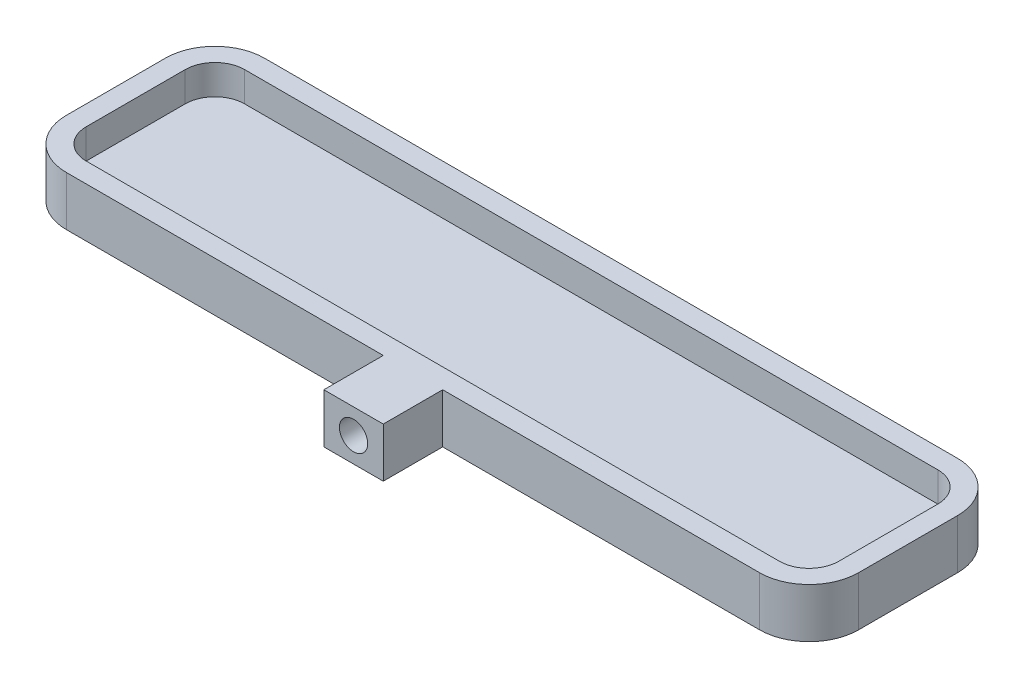
ISO-10303-21;
HEADER;
FILE_DESCRIPTION(('STEP AP214'),'2;1');
FILE_NAME('part.step','',(''),(''),'','','');
FILE_SCHEMA(('AUTOMOTIVE_DESIGN { 1 0 10303 214 1 1 1 1 }'));
ENDSEC;
DATA;
#1=APPLICATION_CONTEXT('core data for automotive mechanical design processes');
#2=APPLICATION_PROTOCOL_DEFINITION('international standard','automotive_design',2000,#1);
#3=PRODUCT_CONTEXT('',#1,'mechanical');
#4=PRODUCT('Part','Part','',(#3));
#5=PRODUCT_RELATED_PRODUCT_CATEGORY('part','',(#4));
#6=PRODUCT_DEFINITION_FORMATION('','',#4);
#7=PRODUCT_DEFINITION_CONTEXT('part definition',#1,'design');
#8=PRODUCT_DEFINITION('design','',#6,#7);
#9=PRODUCT_DEFINITION_SHAPE('','',#8);
#10=(LENGTH_UNIT() NAMED_UNIT(*) SI_UNIT(.MILLI.,.METRE.));
#11=(NAMED_UNIT(*) PLANE_ANGLE_UNIT() SI_UNIT($,.RADIAN.));
#12=(NAMED_UNIT(*) SI_UNIT($,.STERADIAN.) SOLID_ANGLE_UNIT());
#13=UNCERTAINTY_MEASURE_WITH_UNIT(LENGTH_MEASURE(1.E-05),#10,'distance_accuracy_value','');
#14=(GEOMETRIC_REPRESENTATION_CONTEXT(3) GLOBAL_UNCERTAINTY_ASSIGNED_CONTEXT((#13)) GLOBAL_UNIT_ASSIGNED_CONTEXT((#10,
#11,#12)) REPRESENTATION_CONTEXT('',''));
#15=CARTESIAN_POINT('',(0.,0.,0.));
#16=DIRECTION('',(0.,0.,1.));
#17=DIRECTION('',(1.,0.,0.));
#18=AXIS2_PLACEMENT_3D('',#15,#16,#17);
#19=CARTESIAN_POINT('',(-40.,5.,10.));
#20=DIRECTION('',(0.,0.,-1.));
#21=DIRECTION('',(-1.,0.,0.));
#22=AXIS2_PLACEMENT_3D('',#19,#20,#21);
#23=PLANE('',#22);
#24=DIRECTION('',(0.,1.,0.));
#25=VECTOR('',#24,1.);
#26=CARTESIAN_POINT('',(3.,0.,10.));
#27=LINE('',#26,#25);
#28=CARTESIAN_POINT('',(3.,0.,10.));
#29=VERTEX_POINT('',#28);
#30=CARTESIAN_POINT('',(3.,5.,10.));
#31=VERTEX_POINT('',#30);
#32=EDGE_CURVE('E202',#29,#31,#27,.T.);
#33=ORIENTED_EDGE('',*,*,#32,.F.);
#34=DIRECTION('',(1.,0.,0.));
#35=VECTOR('',#34,1.);
#36=CARTESIAN_POINT('',(-40.,0.,10.));
#37=LINE('',#36,#35);
#38=CARTESIAN_POINT('',(35.,0.,10.));
#39=VERTEX_POINT('',#38);
#40=EDGE_CURVE('E322',#29,#39,#37,.T.);
#41=ORIENTED_EDGE('',*,*,#40,.T.);
#42=DIRECTION('',(0.,-1.,0.));
#43=VECTOR('',#42,1.);
#44=CARTESIAN_POINT('',(35.,5.,10.));
#45=LINE('',#44,#43);
#46=CARTESIAN_POINT('',(35.,5.,10.));
#47=VERTEX_POINT('',#46);
#48=EDGE_CURVE('E367',#39,#47,#45,.F.);
#49=ORIENTED_EDGE('',*,*,#48,.T.);
#50=DIRECTION('',(1.,0.,0.));
#51=VECTOR('',#50,1.);
#52=CARTESIAN_POINT('',(-40.,5.,10.));
#53=LINE('',#52,#51);
#54=EDGE_CURVE('E55',#31,#47,#53,.T.);
#55=ORIENTED_EDGE('',*,*,#54,.F.);
#56=EDGE_LOOP('',(#33,#41,#49,#55));
#57=FACE_BOUND('',#56,.T.);
#58=ADVANCED_FACE('F39',(#57),#23,.F.);
#59=DIRECTION('',(0.,-1.,0.));
#60=VECTOR('',#59,1.);
#61=CARTESIAN_POINT('',(-3.,0.,10.));
#62=LINE('',#61,#60);
#63=CARTESIAN_POINT('',(-3.,5.,10.));
#64=VERTEX_POINT('',#63);
#65=CARTESIAN_POINT('',(-3.,0.,10.));
#66=VERTEX_POINT('',#65);
#67=EDGE_CURVE('E63',#64,#66,#62,.T.);
#68=ORIENTED_EDGE('',*,*,#67,.F.);
#69=CARTESIAN_POINT('',(-35.,5.,10.));
#70=VERTEX_POINT('',#69);
#71=EDGE_CURVE('E307',#70,#64,#53,.T.);
#72=ORIENTED_EDGE('',*,*,#71,.F.);
#73=DIRECTION('',(0.,-1.,0.));
#74=VECTOR('',#73,1.);
#75=CARTESIAN_POINT('',(-35.,5.,10.));
#76=LINE('',#75,#74);
#77=CARTESIAN_POINT('',(-35.,0.,10.));
#78=VERTEX_POINT('',#77);
#79=EDGE_CURVE('E363',#70,#78,#76,.T.);
#80=ORIENTED_EDGE('',*,*,#79,.T.);
#81=EDGE_CURVE('E299',#78,#66,#37,.T.);
#82=ORIENTED_EDGE('',*,*,#81,.T.);
#83=EDGE_LOOP('',(#68,#72,#80,#82));
#84=FACE_BOUND('',#83,.T.);
#85=ADVANCED_FACE('F388',(#84),#23,.F.);
#86=CARTESIAN_POINT('',(40.,5.,10.));
#87=DIRECTION('',(-1.,0.,0.));
#88=DIRECTION('',(0.,0.,1.));
#89=AXIS2_PLACEMENT_3D('',#86,#87,#88);
#90=PLANE('',#89);
#91=DIRECTION('',(0.,0.,-1.));
#92=VECTOR('',#91,1.);
#93=CARTESIAN_POINT('',(40.,0.,10.));
#94=LINE('',#93,#92);
#95=CARTESIAN_POINT('',(40.,0.,5.));
#96=VERTEX_POINT('',#95);
#97=CARTESIAN_POINT('',(40.,0.,-5.));
#98=VERTEX_POINT('',#97);
#99=EDGE_CURVE('E263',#96,#98,#94,.T.);
#100=ORIENTED_EDGE('',*,*,#99,.T.);
#101=DIRECTION('',(0.,-1.,0.));
#102=VECTOR('',#101,1.);
#103=CARTESIAN_POINT('',(40.,5.,-5.));
#104=LINE('',#103,#102);
#105=CARTESIAN_POINT('',(40.,5.,-5.));
#106=VERTEX_POINT('',#105);
#107=EDGE_CURVE('E348',#98,#106,#104,.F.);
#108=ORIENTED_EDGE('',*,*,#107,.T.);
#109=DIRECTION('',(0.,0.,-1.));
#110=VECTOR('',#109,1.);
#111=CARTESIAN_POINT('',(40.,5.,10.));
#112=LINE('',#111,#110);
#113=CARTESIAN_POINT('',(40.,5.,5.));
#114=VERTEX_POINT('',#113);
#115=EDGE_CURVE('E295',#114,#106,#112,.T.);
#116=ORIENTED_EDGE('',*,*,#115,.F.);
#117=DIRECTION('',(0.,-1.,0.));
#118=VECTOR('',#117,1.);
#119=CARTESIAN_POINT('',(40.,5.,5.));
#120=LINE('',#119,#118);
#121=EDGE_CURVE('E344',#114,#96,#120,.T.);
#122=ORIENTED_EDGE('',*,*,#121,.T.);
#123=EDGE_LOOP('',(#100,#108,#116,#122));
#124=FACE_BOUND('',#123,.T.);
#125=ADVANCED_FACE('F413',(#124),#90,.F.);
#126=CARTESIAN_POINT('',(-40.,5.,-10.));
#127=DIRECTION('',(0.,0.,1.));
#128=DIRECTION('',(1.,0.,0.));
#129=AXIS2_PLACEMENT_3D('',#126,#127,#128);
#130=PLANE('',#129);
#131=DIRECTION('',(-1.,0.,0.));
#132=VECTOR('',#131,1.);
#133=CARTESIAN_POINT('',(-40.,5.,-10.));
#134=LINE('',#133,#132);
#135=CARTESIAN_POINT('',(35.,5.,-10.));
#136=VERTEX_POINT('',#135);
#137=CARTESIAN_POINT('',(-35.,5.,-10.));
#138=VERTEX_POINT('',#137);
#139=EDGE_CURVE('E298',#136,#138,#134,.T.);
#140=ORIENTED_EDGE('',*,*,#139,.F.);
#141=DIRECTION('',(0.,-1.,0.));
#142=VECTOR('',#141,1.);
#143=CARTESIAN_POINT('',(35.,5.,-10.));
#144=LINE('',#143,#142);
#145=CARTESIAN_POINT('',(35.,0.,-10.));
#146=VERTEX_POINT('',#145);
#147=EDGE_CURVE('E327',#136,#146,#144,.T.);
#148=ORIENTED_EDGE('',*,*,#147,.T.);
#149=DIRECTION('',(-1.,0.,0.));
#150=VECTOR('',#149,1.);
#151=CARTESIAN_POINT('',(-40.,0.,-10.));
#152=LINE('',#151,#150);
#153=CARTESIAN_POINT('',(-35.,0.,-10.));
#154=VERTEX_POINT('',#153);
#155=EDGE_CURVE('E314',#146,#154,#152,.T.);
#156=ORIENTED_EDGE('',*,*,#155,.T.);
#157=DIRECTION('',(0.,-1.,0.));
#158=VECTOR('',#157,1.);
#159=CARTESIAN_POINT('',(-35.,5.,-10.));
#160=LINE('',#159,#158);
#161=EDGE_CURVE('E310',#154,#138,#160,.F.);
#162=ORIENTED_EDGE('',*,*,#161,.T.);
#163=EDGE_LOOP('',(#140,#148,#156,#162));
#164=FACE_BOUND('',#163,.T.);
#165=ADVANCED_FACE('F419',(#164),#130,.F.);
#166=CARTESIAN_POINT('',(-40.,5.,10.));
#167=DIRECTION('',(1.,0.,0.));
#168=DIRECTION('',(0.,0.,-1.));
#169=AXIS2_PLACEMENT_3D('',#166,#167,#168);
#170=PLANE('',#169);
#171=DIRECTION('',(0.,0.,1.));
#172=VECTOR('',#171,1.);
#173=CARTESIAN_POINT('',(-40.,0.,10.));
#174=LINE('',#173,#172);
#175=CARTESIAN_POINT('',(-40.,0.,-5.));
#176=VERTEX_POINT('',#175);
#177=CARTESIAN_POINT('',(-40.,0.,5.));
#178=VERTEX_POINT('',#177);
#179=EDGE_CURVE('E318',#176,#178,#174,.T.);
#180=ORIENTED_EDGE('',*,*,#179,.T.);
#181=DIRECTION('',(0.,-1.,0.));
#182=VECTOR('',#181,1.);
#183=CARTESIAN_POINT('',(-40.,5.,5.));
#184=LINE('',#183,#182);
#185=CARTESIAN_POINT('',(-40.,5.,5.));
#186=VERTEX_POINT('',#185);
#187=EDGE_CURVE('E11',#178,#186,#184,.F.);
#188=ORIENTED_EDGE('',*,*,#187,.T.);
#189=DIRECTION('',(0.,0.,1.));
#190=VECTOR('',#189,1.);
#191=CARTESIAN_POINT('',(-40.,5.,10.));
#192=LINE('',#191,#190);
#193=CARTESIAN_POINT('',(-40.,5.,-5.));
#194=VERTEX_POINT('',#193);
#195=EDGE_CURVE('E303',#194,#186,#192,.T.);
#196=ORIENTED_EDGE('',*,*,#195,.F.);
#197=DIRECTION('',(0.,-1.,0.));
#198=VECTOR('',#197,1.);
#199=CARTESIAN_POINT('',(-40.,5.,-5.));
#200=LINE('',#199,#198);
#201=EDGE_CURVE('E48',#194,#176,#200,.T.);
#202=ORIENTED_EDGE('',*,*,#201,.T.);
#203=EDGE_LOOP('',(#180,#188,#196,#202));
#204=FACE_BOUND('',#203,.T.);
#205=ADVANCED_FACE('F375',(#204),#170,.F.);
#206=CARTESIAN_POINT('',(0.,5.,0.));
#207=DIRECTION('',(0.,-1.,0.));
#208=DIRECTION('',(0.,0.,-1.));
#209=AXIS2_PLACEMENT_3D('',#206,#207,#208);
#210=PLANE('',#209);
#211=DIRECTION('',(0.,0.,-1.));
#212=VECTOR('',#211,1.);
#213=CARTESIAN_POINT('',(38.,5.,0.));
#214=LINE('',#213,#212);
#215=CARTESIAN_POINT('',(38.,5.,5.));
#216=VERTEX_POINT('',#215);
#217=CARTESIAN_POINT('',(38.,5.,-5.));
#218=VERTEX_POINT('',#217);
#219=EDGE_CURVE('E238',#216,#218,#214,.T.);
#220=ORIENTED_EDGE('',*,*,#219,.F.);
#221=CARTESIAN_POINT('',(35.,5.,5.));
#222=DIRECTION('',(0.,-1.,0.));
#223=DIRECTION('',(0.,0.,-1.));
#224=AXIS2_PLACEMENT_3D('',#221,#222,#223);
#225=CIRCLE('',#224,3.);
#226=CARTESIAN_POINT('',(35.,5.,8.));
#227=VERTEX_POINT('',#226);
#228=EDGE_CURVE('E278',#227,#216,#225,.F.);
#229=ORIENTED_EDGE('',*,*,#228,.F.);
#230=DIRECTION('',(1.,0.,0.));
#231=VECTOR('',#230,1.);
#232=CARTESIAN_POINT('',(0.,5.,8.));
#233=LINE('',#232,#231);
#234=CARTESIAN_POINT('',(-35.,5.,8.));
#235=VERTEX_POINT('',#234);
#236=EDGE_CURVE('E254',#235,#227,#233,.T.);
#237=ORIENTED_EDGE('',*,*,#236,.F.);
#238=CARTESIAN_POINT('',(-35.,5.,5.));
#239=DIRECTION('',(0.,-1.,0.));
#240=DIRECTION('',(0.,0.,-1.));
#241=AXIS2_PLACEMENT_3D('',#238,#239,#240);
#242=CIRCLE('',#241,3.);
#243=CARTESIAN_POINT('',(-38.,5.,5.));
#244=VERTEX_POINT('',#243);
#245=EDGE_CURVE('E285',#244,#235,#242,.F.);
#246=ORIENTED_EDGE('',*,*,#245,.F.);
#247=DIRECTION('',(0.,0.,1.));
#248=VECTOR('',#247,1.);
#249=CARTESIAN_POINT('',(-38.,5.,0.));
#250=LINE('',#249,#248);
#251=CARTESIAN_POINT('',(-38.,5.,-5.));
#252=VERTEX_POINT('',#251);
#253=EDGE_CURVE('E282',#252,#244,#250,.T.);
#254=ORIENTED_EDGE('',*,*,#253,.F.);
#255=CARTESIAN_POINT('',(-35.,5.,-5.));
#256=DIRECTION('',(0.,-1.,0.));
#257=DIRECTION('',(0.,0.,-1.));
#258=AXIS2_PLACEMENT_3D('',#255,#256,#257);
#259=CIRCLE('',#258,3.);
#260=CARTESIAN_POINT('',(-35.,5.,-8.));
#261=VERTEX_POINT('',#260);
#262=EDGE_CURVE('E218',#261,#252,#259,.F.);
#263=ORIENTED_EDGE('',*,*,#262,.F.);
#264=DIRECTION('',(-1.,0.,0.));
#265=VECTOR('',#264,1.);
#266=CARTESIAN_POINT('',(0.,5.,-8.));
#267=LINE('',#266,#265);
#268=CARTESIAN_POINT('',(35.,5.,-8.));
#269=VERTEX_POINT('',#268);
#270=EDGE_CURVE('E275',#269,#261,#267,.T.);
#271=ORIENTED_EDGE('',*,*,#270,.F.);
#272=CARTESIAN_POINT('',(35.,5.,-5.));
#273=DIRECTION('',(0.,-1.,0.));
#274=DIRECTION('',(0.,0.,-1.));
#275=AXIS2_PLACEMENT_3D('',#272,#273,#274);
#276=CIRCLE('',#275,3.);
#277=EDGE_CURVE('E268',#218,#269,#276,.F.);
#278=ORIENTED_EDGE('',*,*,#277,.F.);
#279=EDGE_LOOP('',(#220,#229,#237,#246,#254,#263,#271,#278));
#280=FACE_BOUND('',#279,.T.);
#281=ORIENTED_EDGE('',*,*,#115,.T.);
#282=CARTESIAN_POINT('',(35.,5.,-5.));
#283=DIRECTION('',(0.,-1.,0.));
#284=DIRECTION('',(0.,0.,-1.));
#285=AXIS2_PLACEMENT_3D('',#282,#283,#284);
#286=CIRCLE('',#285,5.);
#287=EDGE_CURVE('E360',#106,#136,#286,.F.);
#288=ORIENTED_EDGE('',*,*,#287,.T.);
#289=ORIENTED_EDGE('',*,*,#139,.T.);
#290=CARTESIAN_POINT('',(-35.,5.,-5.));
#291=DIRECTION('',(0.,-1.,0.));
#292=DIRECTION('',(0.,0.,-1.));
#293=AXIS2_PLACEMENT_3D('',#290,#291,#292);
#294=CIRCLE('',#293,5.);
#295=EDGE_CURVE('E351',#138,#194,#294,.F.);
#296=ORIENTED_EDGE('',*,*,#295,.T.);
#297=ORIENTED_EDGE('',*,*,#195,.T.);
#298=CARTESIAN_POINT('',(-35.,5.,5.));
#299=DIRECTION('',(0.,-1.,0.));
#300=DIRECTION('',(0.,0.,-1.));
#301=AXIS2_PLACEMENT_3D('',#298,#299,#300);
#302=CIRCLE('',#301,5.);
#303=EDGE_CURVE('E354',#186,#70,#302,.F.);
#304=ORIENTED_EDGE('',*,*,#303,.T.);
#305=ORIENTED_EDGE('',*,*,#71,.T.);
#306=DIRECTION('',(0.,0.,-1.));
#307=VECTOR('',#306,1.);
#308=CARTESIAN_POINT('',(-3.,5.,16.));
#309=LINE('',#308,#307);
#310=CARTESIAN_POINT('',(-3.,5.,16.));
#311=VERTEX_POINT('',#310);
#312=EDGE_CURVE('E185',#311,#64,#309,.T.);
#313=ORIENTED_EDGE('',*,*,#312,.F.);
#314=DIRECTION('',(-1.,0.,0.));
#315=VECTOR('',#314,1.);
#316=CARTESIAN_POINT('',(-3.,5.,16.));
#317=LINE('',#316,#315);
#318=CARTESIAN_POINT('',(3.,5.,16.));
#319=VERTEX_POINT('',#318);
#320=EDGE_CURVE('E177',#319,#311,#317,.T.);
#321=ORIENTED_EDGE('',*,*,#320,.F.);
#322=DIRECTION('',(0.,0.,-1.));
#323=VECTOR('',#322,1.);
#324=CARTESIAN_POINT('',(3.,5.,16.));
#325=LINE('',#324,#323);
#326=EDGE_CURVE('E182',#319,#31,#325,.T.);
#327=ORIENTED_EDGE('',*,*,#326,.T.);
#328=ORIENTED_EDGE('',*,*,#54,.T.);
#329=CARTESIAN_POINT('',(35.,5.,5.));
#330=DIRECTION('',(0.,-1.,0.));
#331=DIRECTION('',(0.,0.,-1.));
#332=AXIS2_PLACEMENT_3D('',#329,#330,#331);
#333=CIRCLE('',#332,5.);
#334=EDGE_CURVE('E357',#47,#114,#333,.F.);
#335=ORIENTED_EDGE('',*,*,#334,.T.);
#336=EDGE_LOOP('',(#281,#288,#289,#296,#297,#304,#305,#313,#321,#327,#328,#335));
#337=FACE_BOUND('',#336,.T.);
#338=ADVANCED_FACE('F180',(#280,#337),#210,.F.);
#339=CARTESIAN_POINT('',(0.,0.,0.));
#340=DIRECTION('',(0.,-1.,0.));
#341=DIRECTION('',(0.,0.,-1.));
#342=AXIS2_PLACEMENT_3D('',#339,#340,#341);
#343=PLANE('',#342);
#344=ORIENTED_EDGE('',*,*,#155,.F.);
#345=CARTESIAN_POINT('',(35.,0.,-5.));
#346=DIRECTION('',(0.,-1.,0.));
#347=DIRECTION('',(0.,0.,-1.));
#348=AXIS2_PLACEMENT_3D('',#345,#346,#347);
#349=CIRCLE('',#348,5.);
#350=EDGE_CURVE('E341',#146,#98,#349,.T.);
#351=ORIENTED_EDGE('',*,*,#350,.T.);
#352=ORIENTED_EDGE('',*,*,#99,.F.);
#353=CARTESIAN_POINT('',(35.,0.,5.));
#354=DIRECTION('',(0.,-1.,0.));
#355=DIRECTION('',(0.,0.,-1.));
#356=AXIS2_PLACEMENT_3D('',#353,#354,#355);
#357=CIRCLE('',#356,5.);
#358=EDGE_CURVE('E337',#96,#39,#357,.T.);
#359=ORIENTED_EDGE('',*,*,#358,.T.);
#360=ORIENTED_EDGE('',*,*,#40,.F.);
#361=DIRECTION('',(0.,0.,-1.));
#362=VECTOR('',#361,1.);
#363=CARTESIAN_POINT('',(3.,0.,16.));
#364=LINE('',#363,#362);
#365=CARTESIAN_POINT('',(3.,0.,16.));
#366=VERTEX_POINT('',#365);
#367=EDGE_CURVE('E395',#366,#29,#364,.T.);
#368=ORIENTED_EDGE('',*,*,#367,.F.);
#369=DIRECTION('',(1.,0.,0.));
#370=VECTOR('',#369,1.);
#371=CARTESIAN_POINT('',(-3.,0.,16.));
#372=LINE('',#371,#370);
#373=CARTESIAN_POINT('',(-3.,0.,16.));
#374=VERTEX_POINT('',#373);
#375=EDGE_CURVE('E195',#374,#366,#372,.T.);
#376=ORIENTED_EDGE('',*,*,#375,.F.);
#377=DIRECTION('',(0.,0.,-1.));
#378=VECTOR('',#377,1.);
#379=CARTESIAN_POINT('',(-3.,0.,16.));
#380=LINE('',#379,#378);
#381=EDGE_CURVE('E211',#374,#66,#380,.T.);
#382=ORIENTED_EDGE('',*,*,#381,.T.);
#383=ORIENTED_EDGE('',*,*,#81,.F.);
#384=CARTESIAN_POINT('',(-35.,0.,5.));
#385=DIRECTION('',(0.,-1.,0.));
#386=DIRECTION('',(0.,0.,-1.));
#387=AXIS2_PLACEMENT_3D('',#384,#385,#386);
#388=CIRCLE('',#387,5.);
#389=EDGE_CURVE('E334',#78,#178,#388,.T.);
#390=ORIENTED_EDGE('',*,*,#389,.T.);
#391=ORIENTED_EDGE('',*,*,#179,.F.);
#392=CARTESIAN_POINT('',(-35.,0.,-5.));
#393=DIRECTION('',(0.,-1.,0.));
#394=DIRECTION('',(0.,0.,-1.));
#395=AXIS2_PLACEMENT_3D('',#392,#393,#394);
#396=CIRCLE('',#395,5.);
#397=EDGE_CURVE('E331',#176,#154,#396,.T.);
#398=ORIENTED_EDGE('',*,*,#397,.T.);
#399=EDGE_LOOP('',(#344,#351,#352,#359,#360,#368,#376,#382,#383,#390,#391,#398));
#400=FACE_BOUND('',#399,.T.);
#401=ADVANCED_FACE('F381',(#400),#343,.T.);
#402=CARTESIAN_POINT('',(35.,5.,-5.));
#403=DIRECTION('',(0.,-1.,0.));
#404=DIRECTION('',(0.,0.,-1.));
#405=AXIS2_PLACEMENT_3D('',#402,#403,#404);
#406=CYLINDRICAL_SURFACE('',#405,5.);
#407=ORIENTED_EDGE('',*,*,#287,.F.);
#408=ORIENTED_EDGE('',*,*,#107,.F.);
#409=ORIENTED_EDGE('',*,*,#350,.F.);
#410=ORIENTED_EDGE('',*,*,#147,.F.);
#411=EDGE_LOOP('',(#407,#408,#409,#410));
#412=FACE_BOUND('',#411,.T.);
#413=ADVANCED_FACE('F426',(#412),#406,.T.);
#414=CARTESIAN_POINT('',(35.,5.,5.));
#415=DIRECTION('',(0.,-1.,0.));
#416=DIRECTION('',(0.,0.,-1.));
#417=AXIS2_PLACEMENT_3D('',#414,#415,#416);
#418=CYLINDRICAL_SURFACE('',#417,5.);
#419=ORIENTED_EDGE('',*,*,#334,.F.);
#420=ORIENTED_EDGE('',*,*,#48,.F.);
#421=ORIENTED_EDGE('',*,*,#358,.F.);
#422=ORIENTED_EDGE('',*,*,#121,.F.);
#423=EDGE_LOOP('',(#419,#420,#421,#422));
#424=FACE_BOUND('',#423,.T.);
#425=ADVANCED_FACE('F429',(#424),#418,.T.);
#426=CARTESIAN_POINT('',(-35.,5.,5.));
#427=DIRECTION('',(0.,-1.,0.));
#428=DIRECTION('',(0.,0.,-1.));
#429=AXIS2_PLACEMENT_3D('',#426,#427,#428);
#430=CYLINDRICAL_SURFACE('',#429,5.);
#431=ORIENTED_EDGE('',*,*,#303,.F.);
#432=ORIENTED_EDGE('',*,*,#187,.F.);
#433=ORIENTED_EDGE('',*,*,#389,.F.);
#434=ORIENTED_EDGE('',*,*,#79,.F.);
#435=EDGE_LOOP('',(#431,#432,#433,#434));
#436=FACE_BOUND('',#435,.T.);
#437=ADVANCED_FACE('F387',(#436),#430,.T.);
#438=CARTESIAN_POINT('',(-35.,5.,-5.));
#439=DIRECTION('',(0.,-1.,0.));
#440=DIRECTION('',(0.,0.,-1.));
#441=AXIS2_PLACEMENT_3D('',#438,#439,#440);
#442=CYLINDRICAL_SURFACE('',#441,5.);
#443=ORIENTED_EDGE('',*,*,#295,.F.);
#444=ORIENTED_EDGE('',*,*,#161,.F.);
#445=ORIENTED_EDGE('',*,*,#397,.F.);
#446=ORIENTED_EDGE('',*,*,#201,.F.);
#447=EDGE_LOOP('',(#443,#444,#445,#446));
#448=FACE_BOUND('',#447,.T.);
#449=ADVANCED_FACE('F41',(#448),#442,.T.);
#450=CARTESIAN_POINT('',(38.,5.,10.));
#451=DIRECTION('',(-1.,0.,0.));
#452=DIRECTION('',(0.,0.,1.));
#453=AXIS2_PLACEMENT_3D('',#450,#451,#452);
#454=PLANE('',#453);
#455=DIRECTION('',(0.,0.,-1.));
#456=VECTOR('',#455,1.);
#457=CARTESIAN_POINT('',(38.,2.,0.));
#458=LINE('',#457,#456);
#459=CARTESIAN_POINT('',(38.,2.,5.));
#460=VERTEX_POINT('',#459);
#461=CARTESIAN_POINT('',(38.,2.,-5.));
#462=VERTEX_POINT('',#461);
#463=EDGE_CURVE('E204',#460,#462,#458,.T.);
#464=ORIENTED_EDGE('',*,*,#463,.F.);
#465=DIRECTION('',(0.,1.,0.));
#466=VECTOR('',#465,1.);
#467=CARTESIAN_POINT('',(38.,5.,5.));
#468=LINE('',#467,#466);
#469=EDGE_CURVE('E219',#216,#460,#468,.F.);
#470=ORIENTED_EDGE('',*,*,#469,.F.);
#471=ORIENTED_EDGE('',*,*,#219,.T.);
#472=DIRECTION('',(0.,1.,0.));
#473=VECTOR('',#472,1.);
#474=CARTESIAN_POINT('',(38.,5.,-5.));
#475=LINE('',#474,#473);
#476=EDGE_CURVE('E215',#462,#218,#475,.T.);
#477=ORIENTED_EDGE('',*,*,#476,.F.);
#478=EDGE_LOOP('',(#464,#470,#471,#477));
#479=FACE_BOUND('',#478,.T.);
#480=ADVANCED_FACE('F437',(#479),#454,.T.);
#481=CARTESIAN_POINT('',(-40.,5.,-8.));
#482=DIRECTION('',(0.,0.,1.));
#483=DIRECTION('',(1.,0.,0.));
#484=AXIS2_PLACEMENT_3D('',#481,#482,#483);
#485=PLANE('',#484);
#486=ORIENTED_EDGE('',*,*,#270,.T.);
#487=DIRECTION('',(0.,1.,0.));
#488=VECTOR('',#487,1.);
#489=CARTESIAN_POINT('',(-35.,5.,-8.));
#490=LINE('',#489,#488);
#491=CARTESIAN_POINT('',(-35.,2.,-8.));
#492=VERTEX_POINT('',#491);
#493=EDGE_CURVE('E251',#492,#261,#490,.T.);
#494=ORIENTED_EDGE('',*,*,#493,.F.);
#495=DIRECTION('',(-1.,0.,0.));
#496=VECTOR('',#495,1.);
#497=CARTESIAN_POINT('',(0.,2.,-8.));
#498=LINE('',#497,#496);
#499=CARTESIAN_POINT('',(35.,2.,-8.));
#500=VERTEX_POINT('',#499);
#501=EDGE_CURVE('E209',#500,#492,#498,.T.);
#502=ORIENTED_EDGE('',*,*,#501,.F.);
#503=DIRECTION('',(0.,1.,0.));
#504=VECTOR('',#503,1.);
#505=CARTESIAN_POINT('',(35.,5.,-8.));
#506=LINE('',#505,#504);
#507=EDGE_CURVE('E247',#269,#500,#506,.F.);
#508=ORIENTED_EDGE('',*,*,#507,.F.);
#509=EDGE_LOOP('',(#486,#494,#502,#508));
#510=FACE_BOUND('',#509,.T.);
#511=ADVANCED_FACE('F441',(#510),#485,.T.);
#512=CARTESIAN_POINT('',(-38.,5.,10.));
#513=DIRECTION('',(1.,0.,0.));
#514=DIRECTION('',(0.,0.,-1.));
#515=AXIS2_PLACEMENT_3D('',#512,#513,#514);
#516=PLANE('',#515);
#517=DIRECTION('',(0.,0.,1.));
#518=VECTOR('',#517,1.);
#519=CARTESIAN_POINT('',(-38.,2.,0.));
#520=LINE('',#519,#518);
#521=CARTESIAN_POINT('',(-38.,2.,-5.));
#522=VERTEX_POINT('',#521);
#523=CARTESIAN_POINT('',(-38.,2.,5.));
#524=VERTEX_POINT('',#523);
#525=EDGE_CURVE('E227',#522,#524,#520,.T.);
#526=ORIENTED_EDGE('',*,*,#525,.F.);
#527=DIRECTION('',(0.,1.,0.));
#528=VECTOR('',#527,1.);
#529=CARTESIAN_POINT('',(-38.,5.,-5.));
#530=LINE('',#529,#528);
#531=EDGE_CURVE('E255',#252,#522,#530,.F.);
#532=ORIENTED_EDGE('',*,*,#531,.F.);
#533=ORIENTED_EDGE('',*,*,#253,.T.);
#534=DIRECTION('',(0.,1.,0.));
#535=VECTOR('',#534,1.);
#536=CARTESIAN_POINT('',(-38.,5.,5.));
#537=LINE('',#536,#535);
#538=EDGE_CURVE('E259',#524,#244,#537,.T.);
#539=ORIENTED_EDGE('',*,*,#538,.F.);
#540=EDGE_LOOP('',(#526,#532,#533,#539));
#541=FACE_BOUND('',#540,.T.);
#542=ADVANCED_FACE('F456',(#541),#516,.T.);
#543=CARTESIAN_POINT('',(-40.,5.,8.));
#544=DIRECTION('',(0.,0.,-1.));
#545=DIRECTION('',(-1.,0.,0.));
#546=AXIS2_PLACEMENT_3D('',#543,#544,#545);
#547=PLANE('',#546);
#548=DIRECTION('',(1.,0.,0.));
#549=VECTOR('',#548,1.);
#550=CARTESIAN_POINT('',(0.,2.,8.));
#551=LINE('',#550,#549);
#552=CARTESIAN_POINT('',(-35.,2.,8.));
#553=VERTEX_POINT('',#552);
#554=CARTESIAN_POINT('',(35.,2.,8.));
#555=VERTEX_POINT('',#554);
#556=EDGE_CURVE('E234',#553,#555,#551,.T.);
#557=ORIENTED_EDGE('',*,*,#556,.F.);
#558=DIRECTION('',(0.,1.,0.));
#559=VECTOR('',#558,1.);
#560=CARTESIAN_POINT('',(-35.,5.,8.));
#561=LINE('',#560,#559);
#562=EDGE_CURVE('E264',#235,#553,#561,.F.);
#563=ORIENTED_EDGE('',*,*,#562,.F.);
#564=ORIENTED_EDGE('',*,*,#236,.T.);
#565=DIRECTION('',(0.,1.,0.));
#566=VECTOR('',#565,1.);
#567=CARTESIAN_POINT('',(35.,5.,8.));
#568=LINE('',#567,#566);
#569=EDGE_CURVE('E260',#555,#227,#568,.T.);
#570=ORIENTED_EDGE('',*,*,#569,.F.);
#571=EDGE_LOOP('',(#557,#563,#564,#570));
#572=FACE_BOUND('',#571,.T.);
#573=ADVANCED_FACE('F465',(#572),#547,.T.);
#574=CARTESIAN_POINT('',(0.,2.,0.));
#575=DIRECTION('',(0.,-1.,0.));
#576=DIRECTION('',(0.,0.,-1.));
#577=AXIS2_PLACEMENT_3D('',#574,#575,#576);
#578=PLANE('',#577);
#579=ORIENTED_EDGE('',*,*,#501,.T.);
#580=CARTESIAN_POINT('',(-35.,2.,-5.));
#581=DIRECTION('',(0.,-1.,0.));
#582=DIRECTION('',(0.,0.,-1.));
#583=AXIS2_PLACEMENT_3D('',#580,#581,#582);
#584=CIRCLE('',#583,3.);
#585=EDGE_CURVE('E241',#522,#492,#584,.T.);
#586=ORIENTED_EDGE('',*,*,#585,.F.);
#587=ORIENTED_EDGE('',*,*,#525,.T.);
#588=CARTESIAN_POINT('',(-35.,2.,5.));
#589=DIRECTION('',(0.,-1.,0.));
#590=DIRECTION('',(0.,0.,-1.));
#591=AXIS2_PLACEMENT_3D('',#588,#589,#590);
#592=CIRCLE('',#591,3.);
#593=EDGE_CURVE('E233',#553,#524,#592,.T.);
#594=ORIENTED_EDGE('',*,*,#593,.F.);
#595=ORIENTED_EDGE('',*,*,#556,.T.);
#596=CARTESIAN_POINT('',(35.,2.,5.));
#597=DIRECTION('',(0.,-1.,0.));
#598=DIRECTION('',(0.,0.,-1.));
#599=AXIS2_PLACEMENT_3D('',#596,#597,#598);
#600=CIRCLE('',#599,3.);
#601=EDGE_CURVE('E230',#460,#555,#600,.T.);
#602=ORIENTED_EDGE('',*,*,#601,.F.);
#603=ORIENTED_EDGE('',*,*,#463,.T.);
#604=CARTESIAN_POINT('',(35.,2.,-5.));
#605=DIRECTION('',(0.,-1.,0.));
#606=DIRECTION('',(0.,0.,-1.));
#607=AXIS2_PLACEMENT_3D('',#604,#605,#606);
#608=CIRCLE('',#607,3.);
#609=EDGE_CURVE('E223',#500,#462,#608,.T.);
#610=ORIENTED_EDGE('',*,*,#609,.F.);
#611=EDGE_LOOP('',(#579,#586,#587,#594,#595,#602,#603,#610));
#612=FACE_BOUND('',#611,.T.);
#613=ADVANCED_FACE('F469',(#612),#578,.F.);
#614=CARTESIAN_POINT('',(35.,5.,-5.));
#615=DIRECTION('',(0.,-1.,0.));
#616=DIRECTION('',(0.,0.,-1.));
#617=AXIS2_PLACEMENT_3D('',#614,#615,#616);
#618=CYLINDRICAL_SURFACE('',#617,3.);
#619=ORIENTED_EDGE('',*,*,#277,.T.);
#620=ORIENTED_EDGE('',*,*,#507,.T.);
#621=ORIENTED_EDGE('',*,*,#609,.T.);
#622=ORIENTED_EDGE('',*,*,#476,.T.);
#623=EDGE_LOOP('',(#619,#620,#621,#622));
#624=FACE_BOUND('',#623,.T.);
#625=ADVANCED_FACE('F473',(#624),#618,.F.);
#626=CARTESIAN_POINT('',(35.,5.,5.));
#627=DIRECTION('',(0.,-1.,0.));
#628=DIRECTION('',(0.,0.,-1.));
#629=AXIS2_PLACEMENT_3D('',#626,#627,#628);
#630=CYLINDRICAL_SURFACE('',#629,3.);
#631=ORIENTED_EDGE('',*,*,#228,.T.);
#632=ORIENTED_EDGE('',*,*,#469,.T.);
#633=ORIENTED_EDGE('',*,*,#601,.T.);
#634=ORIENTED_EDGE('',*,*,#569,.T.);
#635=EDGE_LOOP('',(#631,#632,#633,#634));
#636=FACE_BOUND('',#635,.T.);
#637=ADVANCED_FACE('F477',(#636),#630,.F.);
#638=CARTESIAN_POINT('',(-35.,5.,5.));
#639=DIRECTION('',(0.,-1.,0.));
#640=DIRECTION('',(0.,0.,-1.));
#641=AXIS2_PLACEMENT_3D('',#638,#639,#640);
#642=CYLINDRICAL_SURFACE('',#641,3.);
#643=ORIENTED_EDGE('',*,*,#245,.T.);
#644=ORIENTED_EDGE('',*,*,#562,.T.);
#645=ORIENTED_EDGE('',*,*,#593,.T.);
#646=ORIENTED_EDGE('',*,*,#538,.T.);
#647=EDGE_LOOP('',(#643,#644,#645,#646));
#648=FACE_BOUND('',#647,.T.);
#649=ADVANCED_FACE('F481',(#648),#642,.F.);
#650=CARTESIAN_POINT('',(-35.,5.,-5.));
#651=DIRECTION('',(0.,-1.,0.));
#652=DIRECTION('',(0.,0.,-1.));
#653=AXIS2_PLACEMENT_3D('',#650,#651,#652);
#654=CYLINDRICAL_SURFACE('',#653,3.);
#655=ORIENTED_EDGE('',*,*,#262,.T.);
#656=ORIENTED_EDGE('',*,*,#531,.T.);
#657=ORIENTED_EDGE('',*,*,#585,.T.);
#658=ORIENTED_EDGE('',*,*,#493,.T.);
#659=EDGE_LOOP('',(#655,#656,#657,#658));
#660=FACE_BOUND('',#659,.T.);
#661=ADVANCED_FACE('F485',(#660),#654,.F.);
#662=CARTESIAN_POINT('',(3.,0.,16.));
#663=DIRECTION('',(-1.,0.,0.));
#664=DIRECTION('',(0.,0.,1.));
#665=AXIS2_PLACEMENT_3D('',#662,#663,#664);
#666=PLANE('',#665);
#667=ORIENTED_EDGE('',*,*,#32,.T.);
#668=ORIENTED_EDGE('',*,*,#326,.F.);
#669=DIRECTION('',(0.,1.,0.));
#670=VECTOR('',#669,1.);
#671=CARTESIAN_POINT('',(3.,0.,16.));
#672=LINE('',#671,#670);
#673=EDGE_CURVE('E190',#366,#319,#672,.T.);
#674=ORIENTED_EDGE('',*,*,#673,.F.);
#675=ORIENTED_EDGE('',*,*,#367,.T.);
#676=EDGE_LOOP('',(#667,#668,#674,#675));
#677=FACE_BOUND('',#676,.T.);
#678=ADVANCED_FACE('F201',(#677),#666,.F.);
#679=CARTESIAN_POINT('',(-3.,0.,16.));
#680=DIRECTION('',(1.,0.,0.));
#681=DIRECTION('',(0.,0.,-1.));
#682=AXIS2_PLACEMENT_3D('',#679,#680,#681);
#683=PLANE('',#682);
#684=ORIENTED_EDGE('',*,*,#67,.T.);
#685=ORIENTED_EDGE('',*,*,#381,.F.);
#686=DIRECTION('',(0.,-1.,0.));
#687=VECTOR('',#686,1.);
#688=CARTESIAN_POINT('',(-3.,0.,16.));
#689=LINE('',#688,#687);
#690=EDGE_CURVE('E189',#311,#374,#689,.T.);
#691=ORIENTED_EDGE('',*,*,#690,.F.);
#692=ORIENTED_EDGE('',*,*,#312,.T.);
#693=EDGE_LOOP('',(#684,#685,#691,#692));
#694=FACE_BOUND('',#693,.T.);
#695=ADVANCED_FACE('F390',(#694),#683,.F.);
#696=CARTESIAN_POINT('',(0.,0.,16.));
#697=DIRECTION('',(0.,0.,-1.));
#698=DIRECTION('',(-1.,0.,0.));
#699=AXIS2_PLACEMENT_3D('',#696,#697,#698);
#700=PLANE('',#699);
#701=CARTESIAN_POINT('',(0.,2.5,16.));
#702=DIRECTION('',(0.,0.,1.));
#703=DIRECTION('',(1.,0.,0.));
#704=AXIS2_PLACEMENT_3D('',#701,#702,#703);
#705=CIRCLE('',#704,1.425);
#706=CARTESIAN_POINT('',(1.425,2.5,16.));
#707=VERTEX_POINT('',#706);
#708=EDGE_CURVE('E657',#707,#707,#705,.T.);
#709=ORIENTED_EDGE('',*,*,#708,.F.);
#710=EDGE_LOOP('',(#709));
#711=FACE_BOUND('',#710,.T.);
#712=ORIENTED_EDGE('',*,*,#673,.T.);
#713=ORIENTED_EDGE('',*,*,#320,.T.);
#714=ORIENTED_EDGE('',*,*,#690,.T.);
#715=ORIENTED_EDGE('',*,*,#375,.T.);
#716=EDGE_LOOP('',(#712,#713,#714,#715));
#717=FACE_BOUND('',#716,.T.);
#718=ADVANCED_FACE('F193',(#711,#717),#700,.F.);
#719=CARTESIAN_POINT('',(0.,2.5,12.));
#720=DIRECTION('',(0.,0.,1.));
#721=DIRECTION('',(1.,0.,0.));
#722=AXIS2_PLACEMENT_3D('',#719,#720,#721);
#723=CYLINDRICAL_SURFACE('',#722,1.425);
#724=CARTESIAN_POINT('',(0.,2.5,12.));
#725=DIRECTION('',(0.,0.,1.));
#726=DIRECTION('',(1.,0.,0.));
#727=AXIS2_PLACEMENT_3D('',#724,#725,#726);
#728=CIRCLE('',#727,1.425);
#729=CARTESIAN_POINT('',(1.425,2.5,12.));
#730=VERTEX_POINT('',#729);
#731=EDGE_CURVE('E400',#730,#730,#728,.T.);
#732=ORIENTED_EDGE('',*,*,#731,.F.);
#733=EDGE_LOOP('',(#732));
#734=FACE_BOUND('',#733,.T.);
#735=ORIENTED_EDGE('',*,*,#708,.T.);
#736=EDGE_LOOP('',(#735));
#737=FACE_BOUND('',#736,.T.);
#738=ADVANCED_FACE('F629',(#734,#737),#723,.F.);
#739=CARTESIAN_POINT('',(0.,2.5,12.));
#740=DIRECTION('',(0.,0.,1.));
#741=DIRECTION('',(1.,0.,0.));
#742=AXIS2_PLACEMENT_3D('',#739,#740,#741);
#743=PLANE('',#742);
#744=ORIENTED_EDGE('',*,*,#731,.T.);
#745=EDGE_LOOP('',(#744));
#746=FACE_BOUND('',#745,.T.);
#747=ADVANCED_FACE('F638',(#746),#743,.T.);
#748=CLOSED_SHELL('',(#58,#85,#125,#165,#205,#338,#401,#413,#425,#437,#449,#480,#511,#542,#573,
#613,#625,#637,#649,#661,#678,#695,#718,#738,#747));
#749=MANIFOLD_SOLID_BREP('B2',#748);
#750=ADVANCED_BREP_SHAPE_REPRESENTATION('',(#18,#749),#14);
#751=SHAPE_DEFINITION_REPRESENTATION(#9,#750);
ENDSEC;
END-ISO-10303-21;
